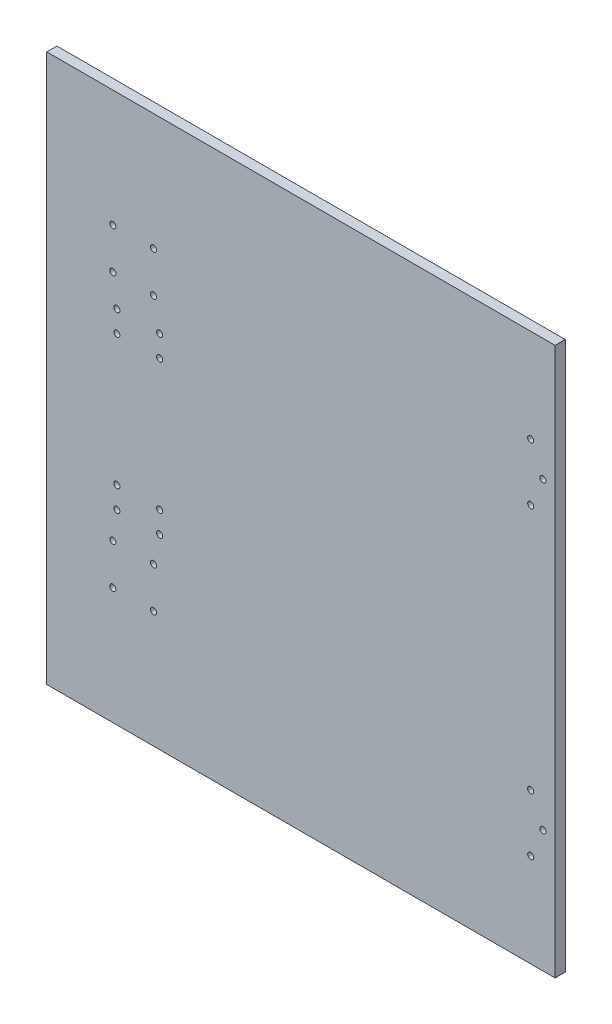
ISO-10303-21;
HEADER;
FILE_DESCRIPTION(('STEP AP214'),'2;1');
FILE_NAME('part.step','',(''),(''),'','','');
FILE_SCHEMA(('AUTOMOTIVE_DESIGN { 1 0 10303 214 1 1 1 1 }'));
ENDSEC;
DATA;
#1=APPLICATION_CONTEXT('core data for automotive mechanical design processes');
#2=APPLICATION_PROTOCOL_DEFINITION('international standard','automotive_design',2000,#1);
#3=PRODUCT_CONTEXT('',#1,'mechanical');
#4=PRODUCT('Part','Part','',(#3));
#5=PRODUCT_RELATED_PRODUCT_CATEGORY('part','',(#4));
#6=PRODUCT_DEFINITION_FORMATION('','',#4);
#7=PRODUCT_DEFINITION_CONTEXT('part definition',#1,'design');
#8=PRODUCT_DEFINITION('design','',#6,#7);
#9=PRODUCT_DEFINITION_SHAPE('','',#8);
#10=(LENGTH_UNIT() NAMED_UNIT(*) SI_UNIT(.MILLI.,.METRE.));
#11=(NAMED_UNIT(*) PLANE_ANGLE_UNIT() SI_UNIT($,.RADIAN.));
#12=(NAMED_UNIT(*) SI_UNIT($,.STERADIAN.) SOLID_ANGLE_UNIT());
#13=UNCERTAINTY_MEASURE_WITH_UNIT(LENGTH_MEASURE(1.E-05),#10,'distance_accuracy_value','');
#14=(GEOMETRIC_REPRESENTATION_CONTEXT(3) GLOBAL_UNCERTAINTY_ASSIGNED_CONTEXT((#13)) GLOBAL_UNIT_ASSIGNED_CONTEXT((#10,
#11,#12)) REPRESENTATION_CONTEXT('',''));
#15=CARTESIAN_POINT('',(0.,0.,0.));
#16=DIRECTION('',(0.,0.,1.));
#17=DIRECTION('',(1.,0.,0.));
#18=AXIS2_PLACEMENT_3D('',#15,#16,#17);
#19=CARTESIAN_POINT('',(125.,134.715,5.));
#20=DIRECTION('',(-1.,0.,0.));
#21=DIRECTION('',(0.,-1.,0.));
#22=AXIS2_PLACEMENT_3D('',#19,#20,#21);
#23=PLANE('',#22);
#24=DIRECTION('',(0.,1.,0.));
#25=VECTOR('',#24,1.);
#26=CARTESIAN_POINT('',(125.,134.715,0.));
#27=LINE('',#26,#25);
#28=CARTESIAN_POINT('',(125.,-134.715,0.));
#29=VERTEX_POINT('',#28);
#30=CARTESIAN_POINT('',(125.,134.715,0.));
#31=VERTEX_POINT('',#30);
#32=EDGE_CURVE('E99',#29,#31,#27,.T.);
#33=ORIENTED_EDGE('',*,*,#32,.T.);
#34=DIRECTION('',(0.,0.,-1.));
#35=VECTOR('',#34,1.);
#36=CARTESIAN_POINT('',(125.,134.715,5.));
#37=LINE('',#36,#35);
#38=CARTESIAN_POINT('',(125.,134.715,5.));
#39=VERTEX_POINT('',#38);
#40=EDGE_CURVE('E11',#39,#31,#37,.T.);
#41=ORIENTED_EDGE('',*,*,#40,.F.);
#42=DIRECTION('',(0.,1.,0.));
#43=VECTOR('',#42,1.);
#44=CARTESIAN_POINT('',(125.,134.715,5.));
#45=LINE('',#44,#43);
#46=CARTESIAN_POINT('',(125.,-134.715,5.));
#47=VERTEX_POINT('',#46);
#48=EDGE_CURVE('E87',#47,#39,#45,.T.);
#49=ORIENTED_EDGE('',*,*,#48,.F.);
#50=DIRECTION('',(0.,0.,-1.));
#51=VECTOR('',#50,1.);
#52=CARTESIAN_POINT('',(125.,-134.715,5.));
#53=LINE('',#52,#51);
#54=EDGE_CURVE('E95',#47,#29,#53,.T.);
#55=ORIENTED_EDGE('',*,*,#54,.T.);
#56=EDGE_LOOP('',(#33,#41,#49,#55));
#57=FACE_BOUND('',#56,.T.);
#58=ADVANCED_FACE('F36',(#57),#23,.F.);
#59=CARTESIAN_POINT('',(-125.,134.715,5.));
#60=DIRECTION('',(0.,-1.,0.));
#61=DIRECTION('',(0.,0.,-1.));
#62=AXIS2_PLACEMENT_3D('',#59,#60,#61);
#63=PLANE('',#62);
#64=DIRECTION('',(-1.,0.,0.));
#65=VECTOR('',#64,1.);
#66=CARTESIAN_POINT('',(-125.,134.715,0.));
#67=LINE('',#66,#65);
#68=CARTESIAN_POINT('',(-125.,134.715,0.));
#69=VERTEX_POINT('',#68);
#70=EDGE_CURVE('E91',#31,#69,#67,.T.);
#71=ORIENTED_EDGE('',*,*,#70,.T.);
#72=DIRECTION('',(0.,0.,-1.));
#73=VECTOR('',#72,1.);
#74=CARTESIAN_POINT('',(-125.,134.715,5.));
#75=LINE('',#74,#73);
#76=CARTESIAN_POINT('',(-125.,134.715,5.));
#77=VERTEX_POINT('',#76);
#78=EDGE_CURVE('E44',#77,#69,#75,.T.);
#79=ORIENTED_EDGE('',*,*,#78,.F.);
#80=DIRECTION('',(-1.,0.,0.));
#81=VECTOR('',#80,1.);
#82=CARTESIAN_POINT('',(-125.,134.715,5.));
#83=LINE('',#82,#81);
#84=EDGE_CURVE('E82',#39,#77,#83,.T.);
#85=ORIENTED_EDGE('',*,*,#84,.F.);
#86=ORIENTED_EDGE('',*,*,#40,.T.);
#87=EDGE_LOOP('',(#71,#79,#85,#86));
#88=FACE_BOUND('',#87,.T.);
#89=ADVANCED_FACE('F90',(#88),#63,.F.);
#90=CARTESIAN_POINT('',(-125.,134.715,5.));
#91=DIRECTION('',(1.,0.,0.));
#92=DIRECTION('',(0.,0.,-1.));
#93=AXIS2_PLACEMENT_3D('',#90,#91,#92);
#94=PLANE('',#93);
#95=DIRECTION('',(0.,-1.,0.));
#96=VECTOR('',#95,1.);
#97=CARTESIAN_POINT('',(-125.,134.715,0.));
#98=LINE('',#97,#96);
#99=CARTESIAN_POINT('',(-125.,-134.715,0.));
#100=VERTEX_POINT('',#99);
#101=EDGE_CURVE('E69',#69,#100,#98,.T.);
#102=ORIENTED_EDGE('',*,*,#101,.T.);
#103=DIRECTION('',(0.,0.,-1.));
#104=VECTOR('',#103,1.);
#105=CARTESIAN_POINT('',(-125.,-134.715,5.));
#106=LINE('',#105,#104);
#107=CARTESIAN_POINT('',(-125.,-134.715,5.));
#108=VERTEX_POINT('',#107);
#109=EDGE_CURVE('E92',#108,#100,#106,.T.);
#110=ORIENTED_EDGE('',*,*,#109,.F.);
#111=DIRECTION('',(0.,-1.,0.));
#112=VECTOR('',#111,1.);
#113=CARTESIAN_POINT('',(-125.,134.715,5.));
#114=LINE('',#113,#112);
#115=EDGE_CURVE('E85',#77,#108,#114,.T.);
#116=ORIENTED_EDGE('',*,*,#115,.F.);
#117=ORIENTED_EDGE('',*,*,#78,.T.);
#118=EDGE_LOOP('',(#102,#110,#116,#117));
#119=FACE_BOUND('',#118,.T.);
#120=ADVANCED_FACE('F93',(#119),#94,.F.);
#121=CARTESIAN_POINT('',(-125.,-134.715,5.));
#122=DIRECTION('',(0.,1.,0.));
#123=DIRECTION('',(0.,0.,1.));
#124=AXIS2_PLACEMENT_3D('',#121,#122,#123);
#125=PLANE('',#124);
#126=DIRECTION('',(1.,0.,0.));
#127=VECTOR('',#126,1.);
#128=CARTESIAN_POINT('',(-125.,-134.715,0.));
#129=LINE('',#128,#127);
#130=EDGE_CURVE('E75',#100,#29,#129,.T.);
#131=ORIENTED_EDGE('',*,*,#130,.T.);
#132=ORIENTED_EDGE('',*,*,#54,.F.);
#133=DIRECTION('',(1.,0.,0.));
#134=VECTOR('',#133,1.);
#135=CARTESIAN_POINT('',(-125.,-134.715,5.));
#136=LINE('',#135,#134);
#137=EDGE_CURVE('E52',#108,#47,#136,.T.);
#138=ORIENTED_EDGE('',*,*,#137,.F.);
#139=ORIENTED_EDGE('',*,*,#109,.T.);
#140=EDGE_LOOP('',(#131,#132,#138,#139));
#141=FACE_BOUND('',#140,.T.);
#142=ADVANCED_FACE('F107',(#141),#125,.F.);
#143=CARTESIAN_POINT('',(0.,0.,5.));
#144=DIRECTION('',(0.,0.,1.));
#145=DIRECTION('',(1.,0.,0.));
#146=AXIS2_PLACEMENT_3D('',#143,#144,#145);
#147=PLANE('',#146);
#148=CARTESIAN_POINT('',(-69.4721359549992,31.9510679775009,5.));
#149=DIRECTION('',(0.,0.,1.));
#150=DIRECTION('',(1.,0.,0.));
#151=AXIS2_PLACEMENT_3D('',#148,#149,#150);
#152=CIRCLE('',#151,1.50000000000001);
#153=CARTESIAN_POINT('',(-67.9721359549991,31.9510679775009,5.));
#154=VERTEX_POINT('',#153);
#155=EDGE_CURVE('E215',#154,#154,#152,.T.);
#156=ORIENTED_EDGE('',*,*,#155,.F.);
#157=EDGE_LOOP('',(#156));
#158=FACE_BOUND('',#157,.T.);
#159=CARTESIAN_POINT('',(-90.527864045,-32.5210679774987,5.));
#160=DIRECTION('',(0.,0.,1.));
#161=DIRECTION('',(1.,0.,0.));
#162=AXIS2_PLACEMENT_3D('',#159,#160,#161);
#163=CIRCLE('',#162,1.5);
#164=CARTESIAN_POINT('',(-89.027864045,-32.5210679774987,5.));
#165=VERTEX_POINT('',#164);
#166=EDGE_CURVE('E222',#165,#165,#163,.T.);
#167=ORIENTED_EDGE('',*,*,#166,.F.);
#168=EDGE_LOOP('',(#167));
#169=FACE_BOUND('',#168,.T.);
#170=CARTESIAN_POINT('',(-90.527864045,-43.0489320224991,5.));
#171=DIRECTION('',(0.,0.,1.));
#172=DIRECTION('',(1.,0.,0.));
#173=AXIS2_PLACEMENT_3D('',#170,#171,#172);
#174=CIRCLE('',#173,1.5);
#175=CARTESIAN_POINT('',(-89.027864045,-43.0489320224991,5.));
#176=VERTEX_POINT('',#175);
#177=EDGE_CURVE('E203',#176,#176,#174,.T.);
#178=ORIENTED_EDGE('',*,*,#177,.F.);
#179=EDGE_LOOP('',(#178));
#180=FACE_BOUND('',#179,.T.);
#181=CARTESIAN_POINT('',(-69.4721359549992,-32.5210679774987,5.));
#182=DIRECTION('',(0.,0.,1.));
#183=DIRECTION('',(1.,0.,0.));
#184=AXIS2_PLACEMENT_3D('',#181,#182,#183);
#185=CIRCLE('',#184,1.5);
#186=CARTESIAN_POINT('',(-67.9721359549991,-32.5210679774987,5.));
#187=VERTEX_POINT('',#186);
#188=EDGE_CURVE('E210',#187,#187,#185,.T.);
#189=ORIENTED_EDGE('',*,*,#188,.F.);
#190=EDGE_LOOP('',(#189));
#191=FACE_BOUND('',#190,.T.);
#192=CARTESIAN_POINT('',(-90.527864045,42.4789320225013,5.));
#193=DIRECTION('',(0.,0.,1.));
#194=DIRECTION('',(1.,0.,0.));
#195=AXIS2_PLACEMENT_3D('',#192,#193,#194);
#196=CIRCLE('',#195,1.5);
#197=CARTESIAN_POINT('',(-89.027864045,42.4789320225013,5.));
#198=VERTEX_POINT('',#197);
#199=EDGE_CURVE('E239',#198,#198,#196,.T.);
#200=ORIENTED_EDGE('',*,*,#199,.F.);
#201=EDGE_LOOP('',(#200));
#202=FACE_BOUND('',#201,.T.);
#203=CARTESIAN_POINT('',(-69.4721359549992,42.4789320225013,5.));
#204=DIRECTION('',(0.,0.,1.));
#205=DIRECTION('',(1.,0.,0.));
#206=AXIS2_PLACEMENT_3D('',#203,#204,#205);
#207=CIRCLE('',#206,1.5);
#208=CARTESIAN_POINT('',(-67.9721359549992,42.4789320225013,5.));
#209=VERTEX_POINT('',#208);
#210=EDGE_CURVE('E227',#209,#209,#207,.T.);
#211=ORIENTED_EDGE('',*,*,#210,.F.);
#212=EDGE_LOOP('',(#211));
#213=FACE_BOUND('',#212,.T.);
#214=CARTESIAN_POINT('',(-90.527864045,31.9510679775009,5.));
#215=DIRECTION('',(0.,0.,1.));
#216=DIRECTION('',(1.,0.,0.));
#217=AXIS2_PLACEMENT_3D('',#214,#215,#216);
#218=CIRCLE('',#217,1.5);
#219=CARTESIAN_POINT('',(-89.027864045,31.9510679775009,5.));
#220=VERTEX_POINT('',#219);
#221=EDGE_CURVE('E234',#220,#220,#218,.T.);
#222=ORIENTED_EDGE('',*,*,#221,.F.);
#223=EDGE_LOOP('',(#222));
#224=FACE_BOUND('',#223,.T.);
#225=CARTESIAN_POINT('',(-69.4721359549992,-43.0489320224991,5.));
#226=DIRECTION('',(0.,0.,1.));
#227=DIRECTION('',(1.,0.,0.));
#228=AXIS2_PLACEMENT_3D('',#225,#226,#227);
#229=CIRCLE('',#228,1.5);
#230=CARTESIAN_POINT('',(-67.9721359549991,-43.0489320224991,5.));
#231=VERTEX_POINT('',#230);
#232=EDGE_CURVE('E197',#231,#231,#229,.T.);
#233=ORIENTED_EDGE('',*,*,#232,.F.);
#234=EDGE_LOOP('',(#233));
#235=FACE_BOUND('',#234,.T.);
#236=CARTESIAN_POINT('',(-92.5000000000005,-57.214999999999,5.));
#237=DIRECTION('',(0.,0.,-1.));
#238=DIRECTION('',(-1.,0.,0.));
#239=AXIS2_PLACEMENT_3D('',#236,#237,#238);
#240=CIRCLE('',#239,1.50000000000058);
#241=CARTESIAN_POINT('',(-94.0000000000011,-57.214999999999,5.));
#242=VERTEX_POINT('',#241);
#243=EDGE_CURVE('E123',#242,#242,#240,.T.);
#244=ORIENTED_EDGE('',*,*,#243,.T.);
#245=EDGE_LOOP('',(#244));
#246=FACE_BOUND('',#245,.T.);
#247=CARTESIAN_POINT('',(-72.5000000000011,-77.2149999999996,5.));
#248=DIRECTION('',(0.,0.,-1.));
#249=DIRECTION('',(-1.,0.,0.));
#250=AXIS2_PLACEMENT_3D('',#247,#248,#249);
#251=CIRCLE('',#250,1.5000000000003);
#252=CARTESIAN_POINT('',(-74.0000000000014,-77.2149999999996,5.));
#253=VERTEX_POINT('',#252);
#254=EDGE_CURVE('E146',#253,#253,#251,.T.);
#255=ORIENTED_EDGE('',*,*,#254,.T.);
#256=EDGE_LOOP('',(#255));
#257=FACE_BOUND('',#256,.T.);
#258=CARTESIAN_POINT('',(-92.5000000000011,-77.214999999999,5.));
#259=DIRECTION('',(0.,0.,-1.));
#260=DIRECTION('',(-1.,0.,0.));
#261=AXIS2_PLACEMENT_3D('',#258,#259,#260);
#262=CIRCLE('',#261,1.5000000000008);
#263=CARTESIAN_POINT('',(-94.0000000000019,-77.214999999999,5.));
#264=VERTEX_POINT('',#263);
#265=EDGE_CURVE('E147',#264,#264,#262,.T.);
#266=ORIENTED_EDGE('',*,*,#265,.T.);
#267=EDGE_LOOP('',(#266));
#268=FACE_BOUND('',#267,.T.);
#269=CARTESIAN_POINT('',(113.,88.7149999999999,5.));
#270=DIRECTION('',(0.,0.,-1.));
#271=DIRECTION('',(-1.,0.,0.));
#272=AXIS2_PLACEMENT_3D('',#269,#270,#271);
#273=CIRCLE('',#272,1.50000000000001);
#274=CARTESIAN_POINT('',(111.5,88.7149999999999,5.));
#275=VERTEX_POINT('',#274);
#276=EDGE_CURVE('E158',#275,#275,#273,.T.);
#277=ORIENTED_EDGE('',*,*,#276,.T.);
#278=EDGE_LOOP('',(#277));
#279=FACE_BOUND('',#278,.T.);
#280=CARTESIAN_POINT('',(-72.5000000000005,-57.2149999999996,5.));
#281=DIRECTION('',(0.,0.,-1.));
#282=DIRECTION('',(-1.,0.,0.));
#283=AXIS2_PLACEMENT_3D('',#280,#281,#282);
#284=CIRCLE('',#283,1.5);
#285=CARTESIAN_POINT('',(-74.0000000000005,-57.2149999999996,5.));
#286=VERTEX_POINT('',#285);
#287=EDGE_CURVE('E122',#286,#286,#284,.T.);
#288=ORIENTED_EDGE('',*,*,#287,.T.);
#289=EDGE_LOOP('',(#288));
#290=FACE_BOUND('',#289,.T.);
#291=CARTESIAN_POINT('',(-72.5000000000009,57.214999999999,5.));
#292=DIRECTION('',(0.,0.,-1.));
#293=DIRECTION('',(-1.,0.,0.));
#294=AXIS2_PLACEMENT_3D('',#291,#292,#293);
#295=CIRCLE('',#294,1.50000000000056);
#296=CARTESIAN_POINT('',(-74.0000000000015,57.214999999999,5.));
#297=VERTEX_POINT('',#296);
#298=EDGE_CURVE('E129',#297,#297,#295,.T.);
#299=ORIENTED_EDGE('',*,*,#298,.T.);
#300=EDGE_LOOP('',(#299));
#301=FACE_BOUND('',#300,.T.);
#302=CARTESIAN_POINT('',(-92.5000000000009,57.2149999999996,5.));
#303=DIRECTION('',(0.,0.,-1.));
#304=DIRECTION('',(-1.,0.,0.));
#305=AXIS2_PLACEMENT_3D('',#302,#303,#304);
#306=CIRCLE('',#305,1.5);
#307=CARTESIAN_POINT('',(-94.0000000000009,57.2149999999996,5.));
#308=VERTEX_POINT('',#307);
#309=EDGE_CURVE('E135',#308,#308,#306,.T.);
#310=ORIENTED_EDGE('',*,*,#309,.T.);
#311=EDGE_LOOP('',(#310));
#312=FACE_BOUND('',#311,.T.);
#313=CARTESIAN_POINT('',(-92.5000000000004,77.2149999999996,5.));
#314=DIRECTION('',(0.,0.,-1.));
#315=DIRECTION('',(-1.,0.,0.));
#316=AXIS2_PLACEMENT_3D('',#313,#314,#315);
#317=CIRCLE('',#316,1.50000000000029);
#318=CARTESIAN_POINT('',(-94.0000000000007,77.2149999999996,5.));
#319=VERTEX_POINT('',#318);
#320=EDGE_CURVE('E116',#319,#319,#317,.T.);
#321=ORIENTED_EDGE('',*,*,#320,.T.);
#322=EDGE_LOOP('',(#321));
#323=FACE_BOUND('',#322,.T.);
#324=CARTESIAN_POINT('',(119.,74.7149999999999,5.));
#325=DIRECTION('',(0.,0.,-1.));
#326=DIRECTION('',(-1.,0.,0.));
#327=AXIS2_PLACEMENT_3D('',#324,#325,#326);
#328=CIRCLE('',#327,1.5);
#329=CARTESIAN_POINT('',(117.5,74.7149999999999,5.));
#330=VERTEX_POINT('',#329);
#331=EDGE_CURVE('E159',#330,#330,#328,.T.);
#332=ORIENTED_EDGE('',*,*,#331,.T.);
#333=EDGE_LOOP('',(#332));
#334=FACE_BOUND('',#333,.T.);
#335=CARTESIAN_POINT('',(113.,60.7149999999999,5.));
#336=DIRECTION('',(0.,0.,-1.));
#337=DIRECTION('',(-1.,0.,0.));
#338=AXIS2_PLACEMENT_3D('',#335,#336,#337);
#339=CIRCLE('',#338,1.5);
#340=CARTESIAN_POINT('',(111.5,60.7149999999999,5.));
#341=VERTEX_POINT('',#340);
#342=EDGE_CURVE('E189',#341,#341,#339,.T.);
#343=ORIENTED_EDGE('',*,*,#342,.T.);
#344=EDGE_LOOP('',(#343));
#345=FACE_BOUND('',#344,.T.);
#346=CARTESIAN_POINT('',(113.,-60.7149999999999,5.));
#347=DIRECTION('',(0.,0.,-1.));
#348=DIRECTION('',(-1.,0.,0.));
#349=AXIS2_PLACEMENT_3D('',#346,#347,#348);
#350=CIRCLE('',#349,1.5);
#351=CARTESIAN_POINT('',(111.5,-60.7149999999999,5.));
#352=VERTEX_POINT('',#351);
#353=EDGE_CURVE('E183',#352,#352,#350,.T.);
#354=ORIENTED_EDGE('',*,*,#353,.T.);
#355=EDGE_LOOP('',(#354));
#356=FACE_BOUND('',#355,.T.);
#357=CARTESIAN_POINT('',(119.,-74.7149999999999,5.));
#358=DIRECTION('',(0.,0.,-1.));
#359=DIRECTION('',(-1.,0.,0.));
#360=AXIS2_PLACEMENT_3D('',#357,#358,#359);
#361=CIRCLE('',#360,1.5);
#362=CARTESIAN_POINT('',(117.5,-74.7149999999999,5.));
#363=VERTEX_POINT('',#362);
#364=EDGE_CURVE('E177',#363,#363,#361,.T.);
#365=ORIENTED_EDGE('',*,*,#364,.T.);
#366=EDGE_LOOP('',(#365));
#367=FACE_BOUND('',#366,.T.);
#368=CARTESIAN_POINT('',(113.,-88.7149999999999,5.));
#369=DIRECTION('',(0.,0.,-1.));
#370=DIRECTION('',(-1.,0.,0.));
#371=AXIS2_PLACEMENT_3D('',#368,#369,#370);
#372=CIRCLE('',#371,1.5);
#373=CARTESIAN_POINT('',(111.5,-88.7149999999999,5.));
#374=VERTEX_POINT('',#373);
#375=EDGE_CURVE('E170',#374,#374,#372,.T.);
#376=ORIENTED_EDGE('',*,*,#375,.T.);
#377=EDGE_LOOP('',(#376));
#378=FACE_BOUND('',#377,.T.);
#379=CARTESIAN_POINT('',(-72.5000000000004,77.214999999999,5.));
#380=DIRECTION('',(0.,0.,-1.));
#381=DIRECTION('',(-1.,0.,0.));
#382=AXIS2_PLACEMENT_3D('',#379,#380,#381);
#383=CIRCLE('',#382,1.5000000000008);
#384=CARTESIAN_POINT('',(-74.0000000000012,77.214999999999,5.));
#385=VERTEX_POINT('',#384);
#386=EDGE_CURVE('E102',#385,#385,#383,.T.);
#387=ORIENTED_EDGE('',*,*,#386,.T.);
#388=EDGE_LOOP('',(#387));
#389=FACE_BOUND('',#388,.T.);
#390=ORIENTED_EDGE('',*,*,#48,.T.);
#391=ORIENTED_EDGE('',*,*,#84,.T.);
#392=ORIENTED_EDGE('',*,*,#115,.T.);
#393=ORIENTED_EDGE('',*,*,#137,.T.);
#394=EDGE_LOOP('',(#390,#391,#392,#393));
#395=FACE_BOUND('',#394,.T.);
#396=ADVANCED_FACE('F83',(#158,#169,#180,#191,#202,#213,#224,#235,#246,#257,#268,#279,#290,#301,
#312,#323,#334,#345,#356,#367,#378,#389,#395),#147,.T.);
#397=CARTESIAN_POINT('',(0.,0.,0.));
#398=DIRECTION('',(0.,0.,1.));
#399=DIRECTION('',(1.,0.,0.));
#400=AXIS2_PLACEMENT_3D('',#397,#398,#399);
#401=PLANE('',#400);
#402=CARTESIAN_POINT('',(-69.4721359549992,31.9510679775009,0.));
#403=DIRECTION('',(0.,0.,1.));
#404=DIRECTION('',(1.,0.,0.));
#405=AXIS2_PLACEMENT_3D('',#402,#403,#404);
#406=CIRCLE('',#405,1.50000000000001);
#407=CARTESIAN_POINT('',(-67.9721359549991,31.9510679775009,0.));
#408=VERTEX_POINT('',#407);
#409=EDGE_CURVE('E218',#408,#408,#406,.T.);
#410=ORIENTED_EDGE('',*,*,#409,.T.);
#411=EDGE_LOOP('',(#410));
#412=FACE_BOUND('',#411,.T.);
#413=CARTESIAN_POINT('',(-90.527864045,-32.5210679774987,0.));
#414=DIRECTION('',(0.,0.,1.));
#415=DIRECTION('',(1.,0.,0.));
#416=AXIS2_PLACEMENT_3D('',#413,#414,#415);
#417=CIRCLE('',#416,1.5);
#418=CARTESIAN_POINT('',(-89.027864045,-32.5210679774987,0.));
#419=VERTEX_POINT('',#418);
#420=EDGE_CURVE('E207',#419,#419,#417,.T.);
#421=ORIENTED_EDGE('',*,*,#420,.T.);
#422=EDGE_LOOP('',(#421));
#423=FACE_BOUND('',#422,.T.);
#424=CARTESIAN_POINT('',(-90.527864045,-43.0489320224991,0.));
#425=DIRECTION('',(0.,0.,1.));
#426=DIRECTION('',(1.,0.,0.));
#427=AXIS2_PLACEMENT_3D('',#424,#425,#426);
#428=CIRCLE('',#427,1.5);
#429=CARTESIAN_POINT('',(-89.027864045,-43.0489320224991,0.));
#430=VERTEX_POINT('',#429);
#431=EDGE_CURVE('E206',#430,#430,#428,.T.);
#432=ORIENTED_EDGE('',*,*,#431,.T.);
#433=EDGE_LOOP('',(#432));
#434=FACE_BOUND('',#433,.T.);
#435=CARTESIAN_POINT('',(-69.4721359549992,-32.5210679774987,0.));
#436=DIRECTION('',(0.,0.,1.));
#437=DIRECTION('',(1.,0.,0.));
#438=AXIS2_PLACEMENT_3D('',#435,#436,#437);
#439=CIRCLE('',#438,1.5);
#440=CARTESIAN_POINT('',(-67.9721359549991,-32.5210679774987,0.));
#441=VERTEX_POINT('',#440);
#442=EDGE_CURVE('E200',#441,#441,#439,.T.);
#443=ORIENTED_EDGE('',*,*,#442,.T.);
#444=EDGE_LOOP('',(#443));
#445=FACE_BOUND('',#444,.T.);
#446=CARTESIAN_POINT('',(-90.527864045,42.4789320225013,0.));
#447=DIRECTION('',(0.,0.,1.));
#448=DIRECTION('',(1.,0.,0.));
#449=AXIS2_PLACEMENT_3D('',#446,#447,#448);
#450=CIRCLE('',#449,1.5);
#451=CARTESIAN_POINT('',(-89.027864045,42.4789320225013,0.));
#452=VERTEX_POINT('',#451);
#453=EDGE_CURVE('E231',#452,#452,#450,.T.);
#454=ORIENTED_EDGE('',*,*,#453,.T.);
#455=EDGE_LOOP('',(#454));
#456=FACE_BOUND('',#455,.T.);
#457=CARTESIAN_POINT('',(-69.4721359549992,42.4789320225013,0.));
#458=DIRECTION('',(0.,0.,1.));
#459=DIRECTION('',(1.,0.,0.));
#460=AXIS2_PLACEMENT_3D('',#457,#458,#459);
#461=CIRCLE('',#460,1.5);
#462=CARTESIAN_POINT('',(-67.9721359549992,42.4789320225013,0.));
#463=VERTEX_POINT('',#462);
#464=EDGE_CURVE('E230',#463,#463,#461,.T.);
#465=ORIENTED_EDGE('',*,*,#464,.T.);
#466=EDGE_LOOP('',(#465));
#467=FACE_BOUND('',#466,.T.);
#468=CARTESIAN_POINT('',(-90.527864045,31.9510679775009,0.));
#469=DIRECTION('',(0.,0.,1.));
#470=DIRECTION('',(1.,0.,0.));
#471=AXIS2_PLACEMENT_3D('',#468,#469,#470);
#472=CIRCLE('',#471,1.5);
#473=CARTESIAN_POINT('',(-89.027864045,31.9510679775009,0.));
#474=VERTEX_POINT('',#473);
#475=EDGE_CURVE('E219',#474,#474,#472,.T.);
#476=ORIENTED_EDGE('',*,*,#475,.T.);
#477=EDGE_LOOP('',(#476));
#478=FACE_BOUND('',#477,.T.);
#479=CARTESIAN_POINT('',(-69.4721359549992,-43.0489320224991,0.));
#480=DIRECTION('',(0.,0.,1.));
#481=DIRECTION('',(1.,0.,0.));
#482=AXIS2_PLACEMENT_3D('',#479,#480,#481);
#483=CIRCLE('',#482,1.5);
#484=CARTESIAN_POINT('',(-67.9721359549991,-43.0489320224991,0.));
#485=VERTEX_POINT('',#484);
#486=EDGE_CURVE('E171',#485,#485,#483,.T.);
#487=ORIENTED_EDGE('',*,*,#486,.T.);
#488=EDGE_LOOP('',(#487));
#489=FACE_BOUND('',#488,.T.);
#490=CARTESIAN_POINT('',(-92.5000000000005,-57.214999999999,0.));
#491=DIRECTION('',(0.,0.,-1.));
#492=DIRECTION('',(-1.,0.,0.));
#493=AXIS2_PLACEMENT_3D('',#490,#491,#492);
#494=CIRCLE('',#493,1.50000000000058);
#495=CARTESIAN_POINT('',(-94.0000000000011,-57.214999999999,0.));
#496=VERTEX_POINT('',#495);
#497=EDGE_CURVE('E150',#496,#496,#494,.T.);
#498=ORIENTED_EDGE('',*,*,#497,.F.);
#499=EDGE_LOOP('',(#498));
#500=FACE_BOUND('',#499,.T.);
#501=CARTESIAN_POINT('',(-72.5000000000011,-77.2149999999996,0.));
#502=DIRECTION('',(0.,0.,-1.));
#503=DIRECTION('',(-1.,0.,0.));
#504=AXIS2_PLACEMENT_3D('',#501,#502,#503);
#505=CIRCLE('',#504,1.5000000000003);
#506=CARTESIAN_POINT('',(-74.0000000000014,-77.2149999999996,0.));
#507=VERTEX_POINT('',#506);
#508=EDGE_CURVE('E143',#507,#507,#505,.T.);
#509=ORIENTED_EDGE('',*,*,#508,.F.);
#510=EDGE_LOOP('',(#509));
#511=FACE_BOUND('',#510,.T.);
#512=CARTESIAN_POINT('',(-92.5000000000011,-77.214999999999,0.));
#513=DIRECTION('',(0.,0.,-1.));
#514=DIRECTION('',(-1.,0.,0.));
#515=AXIS2_PLACEMENT_3D('',#512,#513,#514);
#516=CIRCLE('',#515,1.5000000000008);
#517=CARTESIAN_POINT('',(-94.0000000000019,-77.214999999999,0.));
#518=VERTEX_POINT('',#517);
#519=EDGE_CURVE('E162',#518,#518,#516,.T.);
#520=ORIENTED_EDGE('',*,*,#519,.F.);
#521=EDGE_LOOP('',(#520));
#522=FACE_BOUND('',#521,.T.);
#523=CARTESIAN_POINT('',(113.,88.7149999999999,0.));
#524=DIRECTION('',(0.,0.,-1.));
#525=DIRECTION('',(-1.,0.,0.));
#526=AXIS2_PLACEMENT_3D('',#523,#524,#525);
#527=CIRCLE('',#526,1.50000000000001);
#528=CARTESIAN_POINT('',(111.5,88.7149999999999,0.));
#529=VERTEX_POINT('',#528);
#530=EDGE_CURVE('E155',#529,#529,#527,.T.);
#531=ORIENTED_EDGE('',*,*,#530,.F.);
#532=EDGE_LOOP('',(#531));
#533=FACE_BOUND('',#532,.T.);
#534=CARTESIAN_POINT('',(-72.5000000000005,-57.2149999999996,0.));
#535=DIRECTION('',(0.,0.,-1.));
#536=DIRECTION('',(-1.,0.,0.));
#537=AXIS2_PLACEMENT_3D('',#534,#535,#536);
#538=CIRCLE('',#537,1.5);
#539=CARTESIAN_POINT('',(-74.0000000000005,-57.2149999999996,0.));
#540=VERTEX_POINT('',#539);
#541=EDGE_CURVE('E119',#540,#540,#538,.T.);
#542=ORIENTED_EDGE('',*,*,#541,.F.);
#543=EDGE_LOOP('',(#542));
#544=FACE_BOUND('',#543,.T.);
#545=CARTESIAN_POINT('',(-72.5000000000009,57.214999999999,0.));
#546=DIRECTION('',(0.,0.,-1.));
#547=DIRECTION('',(-1.,0.,0.));
#548=AXIS2_PLACEMENT_3D('',#545,#546,#547);
#549=CIRCLE('',#548,1.50000000000056);
#550=CARTESIAN_POINT('',(-74.0000000000015,57.214999999999,0.));
#551=VERTEX_POINT('',#550);
#552=EDGE_CURVE('E126',#551,#551,#549,.T.);
#553=ORIENTED_EDGE('',*,*,#552,.F.);
#554=EDGE_LOOP('',(#553));
#555=FACE_BOUND('',#554,.T.);
#556=CARTESIAN_POINT('',(-92.5000000000009,57.2149999999996,0.));
#557=DIRECTION('',(0.,0.,-1.));
#558=DIRECTION('',(-1.,0.,0.));
#559=AXIS2_PLACEMENT_3D('',#556,#557,#558);
#560=CIRCLE('',#559,1.5);
#561=CARTESIAN_POINT('',(-94.0000000000009,57.2149999999996,0.));
#562=VERTEX_POINT('',#561);
#563=EDGE_CURVE('E132',#562,#562,#560,.T.);
#564=ORIENTED_EDGE('',*,*,#563,.F.);
#565=EDGE_LOOP('',(#564));
#566=FACE_BOUND('',#565,.T.);
#567=CARTESIAN_POINT('',(-92.5000000000004,77.2149999999996,0.));
#568=DIRECTION('',(0.,0.,-1.));
#569=DIRECTION('',(-1.,0.,0.));
#570=AXIS2_PLACEMENT_3D('',#567,#568,#569);
#571=CIRCLE('',#570,1.50000000000029);
#572=CARTESIAN_POINT('',(-94.0000000000007,77.2149999999996,0.));
#573=VERTEX_POINT('',#572);
#574=EDGE_CURVE('E138',#573,#573,#571,.T.);
#575=ORIENTED_EDGE('',*,*,#574,.F.);
#576=EDGE_LOOP('',(#575));
#577=FACE_BOUND('',#576,.T.);
#578=CARTESIAN_POINT('',(119.,74.7149999999999,0.));
#579=DIRECTION('',(0.,0.,-1.));
#580=DIRECTION('',(-1.,0.,0.));
#581=AXIS2_PLACEMENT_3D('',#578,#579,#580);
#582=CIRCLE('',#581,1.5);
#583=CARTESIAN_POINT('',(117.5,74.7149999999999,0.));
#584=VERTEX_POINT('',#583);
#585=EDGE_CURVE('E192',#584,#584,#582,.T.);
#586=ORIENTED_EDGE('',*,*,#585,.F.);
#587=EDGE_LOOP('',(#586));
#588=FACE_BOUND('',#587,.T.);
#589=CARTESIAN_POINT('',(113.,60.7149999999999,0.));
#590=DIRECTION('',(0.,0.,-1.));
#591=DIRECTION('',(-1.,0.,0.));
#592=AXIS2_PLACEMENT_3D('',#589,#590,#591);
#593=CIRCLE('',#592,1.5);
#594=CARTESIAN_POINT('',(111.5,60.7149999999999,0.));
#595=VERTEX_POINT('',#594);
#596=EDGE_CURVE('E186',#595,#595,#593,.T.);
#597=ORIENTED_EDGE('',*,*,#596,.F.);
#598=EDGE_LOOP('',(#597));
#599=FACE_BOUND('',#598,.T.);
#600=CARTESIAN_POINT('',(113.,-60.7149999999999,0.));
#601=DIRECTION('',(0.,0.,-1.));
#602=DIRECTION('',(-1.,0.,0.));
#603=AXIS2_PLACEMENT_3D('',#600,#601,#602);
#604=CIRCLE('',#603,1.5);
#605=CARTESIAN_POINT('',(111.5,-60.7149999999999,0.));
#606=VERTEX_POINT('',#605);
#607=EDGE_CURVE('E180',#606,#606,#604,.T.);
#608=ORIENTED_EDGE('',*,*,#607,.F.);
#609=EDGE_LOOP('',(#608));
#610=FACE_BOUND('',#609,.T.);
#611=CARTESIAN_POINT('',(119.,-74.7149999999999,0.));
#612=DIRECTION('',(0.,0.,-1.));
#613=DIRECTION('',(-1.,0.,0.));
#614=AXIS2_PLACEMENT_3D('',#611,#612,#613);
#615=CIRCLE('',#614,1.5);
#616=CARTESIAN_POINT('',(117.5,-74.7149999999999,0.));
#617=VERTEX_POINT('',#616);
#618=EDGE_CURVE('E174',#617,#617,#615,.T.);
#619=ORIENTED_EDGE('',*,*,#618,.F.);
#620=EDGE_LOOP('',(#619));
#621=FACE_BOUND('',#620,.T.);
#622=CARTESIAN_POINT('',(113.,-88.7149999999999,0.));
#623=DIRECTION('',(0.,0.,-1.));
#624=DIRECTION('',(-1.,0.,0.));
#625=AXIS2_PLACEMENT_3D('',#622,#623,#624);
#626=CIRCLE('',#625,1.5);
#627=CARTESIAN_POINT('',(111.5,-88.7149999999999,0.));
#628=VERTEX_POINT('',#627);
#629=EDGE_CURVE('E167',#628,#628,#626,.T.);
#630=ORIENTED_EDGE('',*,*,#629,.F.);
#631=EDGE_LOOP('',(#630));
#632=FACE_BOUND('',#631,.T.);
#633=CARTESIAN_POINT('',(-72.5000000000004,77.214999999999,0.));
#634=DIRECTION('',(0.,0.,-1.));
#635=DIRECTION('',(-1.,0.,0.));
#636=AXIS2_PLACEMENT_3D('',#633,#634,#635);
#637=CIRCLE('',#636,1.5000000000008);
#638=CARTESIAN_POINT('',(-74.0000000000012,77.214999999999,0.));
#639=VERTEX_POINT('',#638);
#640=EDGE_CURVE('E113',#639,#639,#637,.T.);
#641=ORIENTED_EDGE('',*,*,#640,.F.);
#642=EDGE_LOOP('',(#641));
#643=FACE_BOUND('',#642,.T.);
#644=ORIENTED_EDGE('',*,*,#32,.F.);
#645=ORIENTED_EDGE('',*,*,#130,.F.);
#646=ORIENTED_EDGE('',*,*,#101,.F.);
#647=ORIENTED_EDGE('',*,*,#70,.F.);
#648=EDGE_LOOP('',(#644,#645,#646,#647));
#649=FACE_BOUND('',#648,.T.);
#650=ADVANCED_FACE('F110',(#412,#423,#434,#445,#456,#467,#478,#489,#500,#511,#522,#533,#544,
#555,#566,#577,#588,#599,#610,#621,#632,#643,#649),#401,.F.);
#651=CARTESIAN_POINT('',(-72.5000000000004,77.214999999999,5.));
#652=DIRECTION('',(0.,0.,-1.));
#653=DIRECTION('',(-1.,0.,0.));
#654=AXIS2_PLACEMENT_3D('',#651,#652,#653);
#655=CYLINDRICAL_SURFACE('',#654,1.5000000000008);
#656=ORIENTED_EDGE('',*,*,#386,.F.);
#657=EDGE_LOOP('',(#656));
#658=FACE_BOUND('',#657,.T.);
#659=ORIENTED_EDGE('',*,*,#640,.T.);
#660=EDGE_LOOP('',(#659));
#661=FACE_BOUND('',#660,.T.);
#662=ADVANCED_FACE('F293',(#658,#661),#655,.F.);
#663=CARTESIAN_POINT('',(113.,-88.7149999999999,5.));
#664=DIRECTION('',(0.,0.,-1.));
#665=DIRECTION('',(-1.,0.,0.));
#666=AXIS2_PLACEMENT_3D('',#663,#664,#665);
#667=CYLINDRICAL_SURFACE('',#666,1.5);
#668=ORIENTED_EDGE('',*,*,#375,.F.);
#669=EDGE_LOOP('',(#668));
#670=FACE_BOUND('',#669,.T.);
#671=ORIENTED_EDGE('',*,*,#629,.T.);
#672=EDGE_LOOP('',(#671));
#673=FACE_BOUND('',#672,.T.);
#674=ADVANCED_FACE('F296',(#670,#673),#667,.F.);
#675=CARTESIAN_POINT('',(119.,-74.7149999999999,5.));
#676=DIRECTION('',(0.,0.,-1.));
#677=DIRECTION('',(-1.,0.,0.));
#678=AXIS2_PLACEMENT_3D('',#675,#676,#677);
#679=CYLINDRICAL_SURFACE('',#678,1.5);
#680=ORIENTED_EDGE('',*,*,#364,.F.);
#681=EDGE_LOOP('',(#680));
#682=FACE_BOUND('',#681,.T.);
#683=ORIENTED_EDGE('',*,*,#618,.T.);
#684=EDGE_LOOP('',(#683));
#685=FACE_BOUND('',#684,.T.);
#686=ADVANCED_FACE('F429',(#682,#685),#679,.F.);
#687=CARTESIAN_POINT('',(113.,-60.7149999999999,5.));
#688=DIRECTION('',(0.,0.,-1.));
#689=DIRECTION('',(-1.,0.,0.));
#690=AXIS2_PLACEMENT_3D('',#687,#688,#689);
#691=CYLINDRICAL_SURFACE('',#690,1.5);
#692=ORIENTED_EDGE('',*,*,#353,.F.);
#693=EDGE_LOOP('',(#692));
#694=FACE_BOUND('',#693,.T.);
#695=ORIENTED_EDGE('',*,*,#607,.T.);
#696=EDGE_LOOP('',(#695));
#697=FACE_BOUND('',#696,.T.);
#698=ADVANCED_FACE('F425',(#694,#697),#691,.F.);
#699=CARTESIAN_POINT('',(113.,60.7149999999999,5.));
#700=DIRECTION('',(0.,0.,-1.));
#701=DIRECTION('',(-1.,0.,0.));
#702=AXIS2_PLACEMENT_3D('',#699,#700,#701);
#703=CYLINDRICAL_SURFACE('',#702,1.5);
#704=ORIENTED_EDGE('',*,*,#342,.F.);
#705=EDGE_LOOP('',(#704));
#706=FACE_BOUND('',#705,.T.);
#707=ORIENTED_EDGE('',*,*,#596,.T.);
#708=EDGE_LOOP('',(#707));
#709=FACE_BOUND('',#708,.T.);
#710=ADVANCED_FACE('F421',(#706,#709),#703,.F.);
#711=CARTESIAN_POINT('',(119.,74.7149999999999,5.));
#712=DIRECTION('',(0.,0.,-1.));
#713=DIRECTION('',(-1.,0.,0.));
#714=AXIS2_PLACEMENT_3D('',#711,#712,#713);
#715=CYLINDRICAL_SURFACE('',#714,1.5);
#716=ORIENTED_EDGE('',*,*,#331,.F.);
#717=EDGE_LOOP('',(#716));
#718=FACE_BOUND('',#717,.T.);
#719=ORIENTED_EDGE('',*,*,#585,.T.);
#720=EDGE_LOOP('',(#719));
#721=FACE_BOUND('',#720,.T.);
#722=ADVANCED_FACE('F417',(#718,#721),#715,.F.);
#723=CARTESIAN_POINT('',(-92.5000000000004,77.2149999999996,5.));
#724=DIRECTION('',(0.,0.,-1.));
#725=DIRECTION('',(-1.,0.,0.));
#726=AXIS2_PLACEMENT_3D('',#723,#724,#725);
#727=CYLINDRICAL_SURFACE('',#726,1.50000000000029);
#728=ORIENTED_EDGE('',*,*,#320,.F.);
#729=EDGE_LOOP('',(#728));
#730=FACE_BOUND('',#729,.T.);
#731=ORIENTED_EDGE('',*,*,#574,.T.);
#732=EDGE_LOOP('',(#731));
#733=FACE_BOUND('',#732,.T.);
#734=ADVANCED_FACE('F420',(#730,#733),#727,.F.);
#735=CARTESIAN_POINT('',(-92.5000000000009,57.2149999999996,5.));
#736=DIRECTION('',(0.,0.,-1.));
#737=DIRECTION('',(-1.,0.,0.));
#738=AXIS2_PLACEMENT_3D('',#735,#736,#737);
#739=CYLINDRICAL_SURFACE('',#738,1.5);
#740=ORIENTED_EDGE('',*,*,#309,.F.);
#741=EDGE_LOOP('',(#740));
#742=FACE_BOUND('',#741,.T.);
#743=ORIENTED_EDGE('',*,*,#563,.T.);
#744=EDGE_LOOP('',(#743));
#745=FACE_BOUND('',#744,.T.);
#746=ADVANCED_FACE('F454',(#742,#745),#739,.F.);
#747=CARTESIAN_POINT('',(-72.5000000000009,57.214999999999,5.));
#748=DIRECTION('',(0.,0.,-1.));
#749=DIRECTION('',(-1.,0.,0.));
#750=AXIS2_PLACEMENT_3D('',#747,#748,#749);
#751=CYLINDRICAL_SURFACE('',#750,1.50000000000056);
#752=ORIENTED_EDGE('',*,*,#298,.F.);
#753=EDGE_LOOP('',(#752));
#754=FACE_BOUND('',#753,.T.);
#755=ORIENTED_EDGE('',*,*,#552,.T.);
#756=EDGE_LOOP('',(#755));
#757=FACE_BOUND('',#756,.T.);
#758=ADVANCED_FACE('F458',(#754,#757),#751,.F.);
#759=CARTESIAN_POINT('',(-72.5000000000005,-57.2149999999996,5.));
#760=DIRECTION('',(0.,0.,-1.));
#761=DIRECTION('',(-1.,0.,0.));
#762=AXIS2_PLACEMENT_3D('',#759,#760,#761);
#763=CYLINDRICAL_SURFACE('',#762,1.5);
#764=ORIENTED_EDGE('',*,*,#287,.F.);
#765=EDGE_LOOP('',(#764));
#766=FACE_BOUND('',#765,.T.);
#767=ORIENTED_EDGE('',*,*,#541,.T.);
#768=EDGE_LOOP('',(#767));
#769=FACE_BOUND('',#768,.T.);
#770=ADVANCED_FACE('F445',(#766,#769),#763,.F.);
#771=CARTESIAN_POINT('',(113.,88.7149999999999,5.));
#772=DIRECTION('',(0.,0.,-1.));
#773=DIRECTION('',(-1.,0.,0.));
#774=AXIS2_PLACEMENT_3D('',#771,#772,#773);
#775=CYLINDRICAL_SURFACE('',#774,1.50000000000001);
#776=ORIENTED_EDGE('',*,*,#276,.F.);
#777=EDGE_LOOP('',(#776));
#778=FACE_BOUND('',#777,.T.);
#779=ORIENTED_EDGE('',*,*,#530,.T.);
#780=EDGE_LOOP('',(#779));
#781=FACE_BOUND('',#780,.T.);
#782=ADVANCED_FACE('F441',(#778,#781),#775,.F.);
#783=CARTESIAN_POINT('',(-92.5000000000011,-77.214999999999,5.));
#784=DIRECTION('',(0.,0.,-1.));
#785=DIRECTION('',(-1.,0.,0.));
#786=AXIS2_PLACEMENT_3D('',#783,#784,#785);
#787=CYLINDRICAL_SURFACE('',#786,1.5000000000008);
#788=ORIENTED_EDGE('',*,*,#265,.F.);
#789=EDGE_LOOP('',(#788));
#790=FACE_BOUND('',#789,.T.);
#791=ORIENTED_EDGE('',*,*,#519,.T.);
#792=EDGE_LOOP('',(#791));
#793=FACE_BOUND('',#792,.T.);
#794=ADVANCED_FACE('F437',(#790,#793),#787,.F.);
#795=CARTESIAN_POINT('',(-72.5000000000011,-77.2149999999996,5.));
#796=DIRECTION('',(0.,0.,-1.));
#797=DIRECTION('',(-1.,0.,0.));
#798=AXIS2_PLACEMENT_3D('',#795,#796,#797);
#799=CYLINDRICAL_SURFACE('',#798,1.5000000000003);
#800=ORIENTED_EDGE('',*,*,#254,.F.);
#801=EDGE_LOOP('',(#800));
#802=FACE_BOUND('',#801,.T.);
#803=ORIENTED_EDGE('',*,*,#508,.T.);
#804=EDGE_LOOP('',(#803));
#805=FACE_BOUND('',#804,.T.);
#806=ADVANCED_FACE('F440',(#802,#805),#799,.F.);
#807=CARTESIAN_POINT('',(-92.5000000000005,-57.214999999999,5.));
#808=DIRECTION('',(0.,0.,-1.));
#809=DIRECTION('',(-1.,0.,0.));
#810=AXIS2_PLACEMENT_3D('',#807,#808,#809);
#811=CYLINDRICAL_SURFACE('',#810,1.50000000000058);
#812=ORIENTED_EDGE('',*,*,#243,.F.);
#813=EDGE_LOOP('',(#812));
#814=FACE_BOUND('',#813,.T.);
#815=ORIENTED_EDGE('',*,*,#497,.T.);
#816=EDGE_LOOP('',(#815));
#817=FACE_BOUND('',#816,.T.);
#818=ADVANCED_FACE('F331',(#814,#817),#811,.F.);
#819=CARTESIAN_POINT('',(-69.4721359549992,-43.0489320224991,0.));
#820=DIRECTION('',(0.,0.,1.));
#821=DIRECTION('',(1.,0.,0.));
#822=AXIS2_PLACEMENT_3D('',#819,#820,#821);
#823=CYLINDRICAL_SURFACE('',#822,1.5);
#824=ORIENTED_EDGE('',*,*,#486,.F.);
#825=EDGE_LOOP('',(#824));
#826=FACE_BOUND('',#825,.T.);
#827=ORIENTED_EDGE('',*,*,#232,.T.);
#828=EDGE_LOOP('',(#827));
#829=FACE_BOUND('',#828,.T.);
#830=ADVANCED_FACE('F341',(#826,#829),#823,.F.);
#831=CARTESIAN_POINT('',(-90.527864045,31.9510679775009,0.));
#832=DIRECTION('',(0.,0.,1.));
#833=DIRECTION('',(1.,0.,0.));
#834=AXIS2_PLACEMENT_3D('',#831,#832,#833);
#835=CYLINDRICAL_SURFACE('',#834,1.5);
#836=ORIENTED_EDGE('',*,*,#475,.F.);
#837=EDGE_LOOP('',(#836));
#838=FACE_BOUND('',#837,.T.);
#839=ORIENTED_EDGE('',*,*,#221,.T.);
#840=EDGE_LOOP('',(#839));
#841=FACE_BOUND('',#840,.T.);
#842=ADVANCED_FACE('F346',(#838,#841),#835,.F.);
#843=CARTESIAN_POINT('',(-69.4721359549992,42.4789320225013,0.));
#844=DIRECTION('',(0.,0.,1.));
#845=DIRECTION('',(1.,0.,0.));
#846=AXIS2_PLACEMENT_3D('',#843,#844,#845);
#847=CYLINDRICAL_SURFACE('',#846,1.5);
#848=ORIENTED_EDGE('',*,*,#464,.F.);
#849=EDGE_LOOP('',(#848));
#850=FACE_BOUND('',#849,.T.);
#851=ORIENTED_EDGE('',*,*,#210,.T.);
#852=EDGE_LOOP('',(#851));
#853=FACE_BOUND('',#852,.T.);
#854=ADVANCED_FACE('F251',(#850,#853),#847,.F.);
#855=CARTESIAN_POINT('',(-90.527864045,42.4789320225013,0.));
#856=DIRECTION('',(0.,0.,1.));
#857=DIRECTION('',(1.,0.,0.));
#858=AXIS2_PLACEMENT_3D('',#855,#856,#857);
#859=CYLINDRICAL_SURFACE('',#858,1.5);
#860=ORIENTED_EDGE('',*,*,#453,.F.);
#861=EDGE_LOOP('',(#860));
#862=FACE_BOUND('',#861,.T.);
#863=ORIENTED_EDGE('',*,*,#199,.T.);
#864=EDGE_LOOP('',(#863));
#865=FACE_BOUND('',#864,.T.);
#866=ADVANCED_FACE('F247',(#862,#865),#859,.F.);
#867=CARTESIAN_POINT('',(-69.4721359549992,-32.5210679774987,0.));
#868=DIRECTION('',(0.,0.,1.));
#869=DIRECTION('',(1.,0.,0.));
#870=AXIS2_PLACEMENT_3D('',#867,#868,#869);
#871=CYLINDRICAL_SURFACE('',#870,1.5);
#872=ORIENTED_EDGE('',*,*,#442,.F.);
#873=EDGE_LOOP('',(#872));
#874=FACE_BOUND('',#873,.T.);
#875=ORIENTED_EDGE('',*,*,#188,.T.);
#876=EDGE_LOOP('',(#875));
#877=FACE_BOUND('',#876,.T.);
#878=ADVANCED_FACE('F250',(#874,#877),#871,.F.);
#879=CARTESIAN_POINT('',(-90.527864045,-43.0489320224991,0.));
#880=DIRECTION('',(0.,0.,1.));
#881=DIRECTION('',(1.,0.,0.));
#882=AXIS2_PLACEMENT_3D('',#879,#880,#881);
#883=CYLINDRICAL_SURFACE('',#882,1.5);
#884=ORIENTED_EDGE('',*,*,#431,.F.);
#885=EDGE_LOOP('',(#884));
#886=FACE_BOUND('',#885,.T.);
#887=ORIENTED_EDGE('',*,*,#177,.T.);
#888=EDGE_LOOP('',(#887));
#889=FACE_BOUND('',#888,.T.);
#890=ADVANCED_FACE('F380',(#886,#889),#883,.F.);
#891=CARTESIAN_POINT('',(-90.527864045,-32.5210679774987,0.));
#892=DIRECTION('',(0.,0.,1.));
#893=DIRECTION('',(1.,0.,0.));
#894=AXIS2_PLACEMENT_3D('',#891,#892,#893);
#895=CYLINDRICAL_SURFACE('',#894,1.5);
#896=ORIENTED_EDGE('',*,*,#420,.F.);
#897=EDGE_LOOP('',(#896));
#898=FACE_BOUND('',#897,.T.);
#899=ORIENTED_EDGE('',*,*,#166,.T.);
#900=EDGE_LOOP('',(#899));
#901=FACE_BOUND('',#900,.T.);
#902=ADVANCED_FACE('F390',(#898,#901),#895,.F.);
#903=CARTESIAN_POINT('',(-69.4721359549992,31.9510679775009,0.));
#904=DIRECTION('',(0.,0.,1.));
#905=DIRECTION('',(1.,0.,0.));
#906=AXIS2_PLACEMENT_3D('',#903,#904,#905);
#907=CYLINDRICAL_SURFACE('',#906,1.50000000000001);
#908=ORIENTED_EDGE('',*,*,#409,.F.);
#909=EDGE_LOOP('',(#908));
#910=FACE_BOUND('',#909,.T.);
#911=ORIENTED_EDGE('',*,*,#155,.T.);
#912=EDGE_LOOP('',(#911));
#913=FACE_BOUND('',#912,.T.);
#914=ADVANCED_FACE('F400',(#910,#913),#907,.F.);
#915=CLOSED_SHELL('',(#58,#89,#120,#142,#396,#650,#662,#674,#686,#698,#710,#722,#734,#746,#758,
#770,#782,#794,#806,#818,#830,#842,#854,#866,#878,#890,#902,#914));
#916=MANIFOLD_SOLID_BREP('B2',#915);
#917=ADVANCED_BREP_SHAPE_REPRESENTATION('',(#18,#916),#14);
#918=SHAPE_DEFINITION_REPRESENTATION(#9,#917);
ENDSEC;
END-ISO-10303-21;
